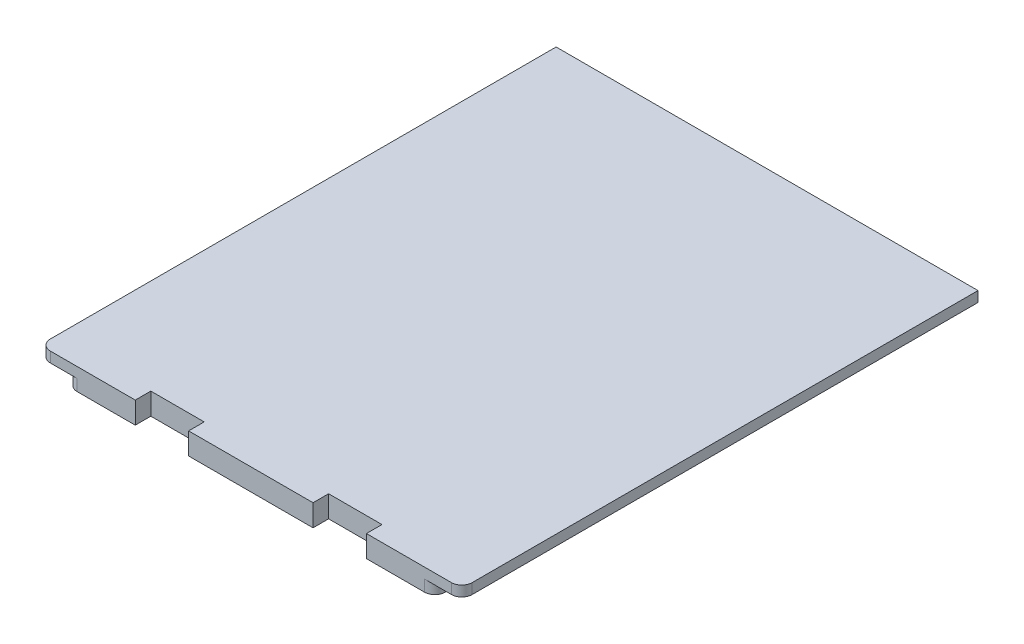
ISO-10303-21;
HEADER;
FILE_DESCRIPTION(('STEP AP214'),'2;1');
FILE_NAME('part.step','',(''),(''),'','','');
FILE_SCHEMA(('AUTOMOTIVE_DESIGN { 1 0 10303 214 1 1 1 1 }'));
ENDSEC;
DATA;
#1=APPLICATION_CONTEXT('core data for automotive mechanical design processes');
#2=APPLICATION_PROTOCOL_DEFINITION('international standard','automotive_design',2000,#1);
#3=PRODUCT_CONTEXT('',#1,'mechanical');
#4=PRODUCT('Part','Part','',(#3));
#5=PRODUCT_RELATED_PRODUCT_CATEGORY('part','',(#4));
#6=PRODUCT_DEFINITION_FORMATION('','',#4);
#7=PRODUCT_DEFINITION_CONTEXT('part definition',#1,'design');
#8=PRODUCT_DEFINITION('design','',#6,#7);
#9=PRODUCT_DEFINITION_SHAPE('','',#8);
#10=(LENGTH_UNIT() NAMED_UNIT(*) SI_UNIT(.MILLI.,.METRE.));
#11=(NAMED_UNIT(*) PLANE_ANGLE_UNIT() SI_UNIT($,.RADIAN.));
#12=(NAMED_UNIT(*) SI_UNIT($,.STERADIAN.) SOLID_ANGLE_UNIT());
#13=UNCERTAINTY_MEASURE_WITH_UNIT(LENGTH_MEASURE(1.E-05),#10,'distance_accuracy_value','');
#14=(GEOMETRIC_REPRESENTATION_CONTEXT(3) GLOBAL_UNCERTAINTY_ASSIGNED_CONTEXT((#13)) GLOBAL_UNIT_ASSIGNED_CONTEXT((#10,
#11,#12)) REPRESENTATION_CONTEXT('',''));
#15=CARTESIAN_POINT('',(0.,0.,0.));
#16=DIRECTION('',(0.,0.,1.));
#17=DIRECTION('',(1.,0.,0.));
#18=AXIS2_PLACEMENT_3D('',#15,#16,#17);
#19=CARTESIAN_POINT('',(35.5,0.,99.6));
#20=DIRECTION('',(0.,1.,0.));
#21=DIRECTION('',(0.,0.,1.));
#22=AXIS2_PLACEMENT_3D('',#19,#20,#21);
#23=PLANE('',#22);
#24=DIRECTION('',(0.,0.,-1.));
#25=VECTOR('',#24,1.);
#26=CARTESIAN_POINT('',(35.5,0.,99.6));
#27=LINE('',#26,#25);
#28=CARTESIAN_POINT('',(35.5,0.,97.6));
#29=VERTEX_POINT('',#28);
#30=CARTESIAN_POINT('',(35.5,0.,0.));
#31=VERTEX_POINT('',#30);
#32=EDGE_CURVE('E316',#29,#31,#27,.T.);
#33=ORIENTED_EDGE('',*,*,#32,.F.);
#34=CARTESIAN_POINT('',(33.5,0.,97.6));
#35=DIRECTION('',(0.,1.,0.));
#36=DIRECTION('',(0.,0.,1.));
#37=AXIS2_PLACEMENT_3D('',#34,#35,#36);
#38=CIRCLE('',#37,2.);
#39=CARTESIAN_POINT('',(33.5,0.,99.6));
#40=VERTEX_POINT('',#39);
#41=EDGE_CURVE('E366',#29,#40,#38,.F.);
#42=ORIENTED_EDGE('',*,*,#41,.T.);
#43=DIRECTION('',(1.,0.,0.));
#44=VECTOR('',#43,1.);
#45=CARTESIAN_POINT('',(35.5,0.,99.6));
#46=LINE('',#45,#44);
#47=CARTESIAN_POINT('',(22.3000000000007,0.,99.6000000000051));
#48=VERTEX_POINT('',#47);
#49=EDGE_CURVE('E245',#48,#40,#46,.T.);
#50=ORIENTED_EDGE('',*,*,#49,.F.);
#51=DIRECTION('',(0.,0.,1.00000000000004));
#52=VECTOR('',#51,1.);
#53=CARTESIAN_POINT('',(22.3000000000008,0.,0.));
#54=LINE('',#53,#52);
#55=CARTESIAN_POINT('',(22.3000000000007,0.,96.6000000000051));
#56=VERTEX_POINT('',#55);
#57=EDGE_CURVE('E399',#56,#48,#54,.T.);
#58=ORIENTED_EDGE('',*,*,#57,.F.);
#59=DIRECTION('',(-1.00000000000004,0.,0.));
#60=VECTOR('',#59,1.);
#61=CARTESIAN_POINT('',(0.,0.,96.6000000000051));
#62=LINE('',#61,#60);
#63=CARTESIAN_POINT('',(12.002190308565,0.,96.6000000000051));
#64=VERTEX_POINT('',#63);
#65=EDGE_CURVE('E419',#56,#64,#62,.T.);
#66=ORIENTED_EDGE('',*,*,#65,.T.);
#67=DIRECTION('',(0.,0.,-1.00000000000004));
#68=VECTOR('',#67,1.);
#69=CARTESIAN_POINT('',(12.002190308565,0.,0.));
#70=LINE('',#69,#68);
#71=CARTESIAN_POINT('',(12.002190308565,0.,99.6000000000051));
#72=VERTEX_POINT('',#71);
#73=EDGE_CURVE('E242',#72,#64,#70,.T.);
#74=ORIENTED_EDGE('',*,*,#73,.F.);
#75=CARTESIAN_POINT('',(-12.0021903085646,0.,99.6000000000022));
#76=VERTEX_POINT('',#75);
#77=EDGE_CURVE('E231',#76,#72,#46,.T.);
#78=ORIENTED_EDGE('',*,*,#77,.F.);
#79=DIRECTION('',(0.,0.,-1.00000000000002));
#80=VECTOR('',#79,1.);
#81=CARTESIAN_POINT('',(-12.0021903085645,0.,0.));
#82=LINE('',#81,#80);
#83=CARTESIAN_POINT('',(-12.0021903085646,0.,96.6000000000022));
#84=VERTEX_POINT('',#83);
#85=EDGE_CURVE('E211',#76,#84,#82,.T.);
#86=ORIENTED_EDGE('',*,*,#85,.T.);
#87=DIRECTION('',(-1.00000000000002,0.,0.));
#88=VECTOR('',#87,1.);
#89=CARTESIAN_POINT('',(0.,0.,96.6000000000022));
#90=LINE('',#89,#88);
#91=CARTESIAN_POINT('',(-22.3000000000002,0.,96.6000000000022));
#92=VERTEX_POINT('',#91);
#93=EDGE_CURVE('E427',#84,#92,#90,.T.);
#94=ORIENTED_EDGE('',*,*,#93,.T.);
#95=DIRECTION('',(0.,0.,1.00000000000002));
#96=VECTOR('',#95,1.);
#97=CARTESIAN_POINT('',(-22.3000000000001,0.,0.));
#98=LINE('',#97,#96);
#99=CARTESIAN_POINT('',(-22.3000000000002,0.,99.6000000000022));
#100=VERTEX_POINT('',#99);
#101=EDGE_CURVE('E223',#92,#100,#98,.T.);
#102=ORIENTED_EDGE('',*,*,#101,.T.);
#103=CARTESIAN_POINT('',(-33.5,0.,99.6));
#104=VERTEX_POINT('',#103);
#105=EDGE_CURVE('E244',#104,#100,#46,.T.);
#106=ORIENTED_EDGE('',*,*,#105,.F.);
#107=CARTESIAN_POINT('',(-33.5,0.,97.6));
#108=DIRECTION('',(0.,1.,0.));
#109=DIRECTION('',(0.,0.,1.));
#110=AXIS2_PLACEMENT_3D('',#107,#108,#109);
#111=CIRCLE('',#110,2.);
#112=CARTESIAN_POINT('',(-35.5,0.,97.6));
#113=VERTEX_POINT('',#112);
#114=EDGE_CURVE('E363',#104,#113,#111,.F.);
#115=ORIENTED_EDGE('',*,*,#114,.T.);
#116=DIRECTION('',(0.,0.,-1.));
#117=VECTOR('',#116,1.);
#118=CARTESIAN_POINT('',(-35.5,0.,99.6));
#119=LINE('',#118,#117);
#120=CARTESIAN_POINT('',(-35.5,0.,0.));
#121=VERTEX_POINT('',#120);
#122=EDGE_CURVE('E319',#113,#121,#119,.T.);
#123=ORIENTED_EDGE('',*,*,#122,.T.);
#124=DIRECTION('',(1.,0.,0.));
#125=VECTOR('',#124,1.);
#126=CARTESIAN_POINT('',(35.5,0.,0.));
#127=LINE('',#126,#125);
#128=EDGE_CURVE('E272',#121,#31,#127,.T.);
#129=ORIENTED_EDGE('',*,*,#128,.T.);
#130=EDGE_LOOP('',(#33,#42,#50,#58,#66,#74,#78,#86,#94,#102,#106,#115,#123,#129));
#131=FACE_BOUND('',#130,.T.);
#132=ADVANCED_FACE('F39',(#131),#23,.F.);
#133=CARTESIAN_POINT('',(-40.7,4.2,99.6));
#134=DIRECTION('',(0.,-1.,0.));
#135=DIRECTION('',(0.,0.,-1.));
#136=AXIS2_PLACEMENT_3D('',#133,#134,#135);
#137=PLANE('',#136);
#138=DIRECTION('',(0.,0.,-1.));
#139=VECTOR('',#138,1.);
#140=CARTESIAN_POINT('',(-12.0021903085646,4.2,99.6));
#141=LINE('',#140,#139);
#142=CARTESIAN_POINT('',(-12.0021903085646,4.2,99.6000000000022));
#143=VERTEX_POINT('',#142);
#144=CARTESIAN_POINT('',(-12.0021903085646,4.2,96.6000000000022));
#145=VERTEX_POINT('',#144);
#146=EDGE_CURVE('E255',#143,#145,#141,.T.);
#147=ORIENTED_EDGE('',*,*,#146,.F.);
#148=DIRECTION('',(-1.,0.,0.));
#149=VECTOR('',#148,1.);
#150=CARTESIAN_POINT('',(-40.7,4.2,99.6));
#151=LINE('',#150,#149);
#152=CARTESIAN_POINT('',(12.002190308565,4.2,99.6));
#153=VERTEX_POINT('',#152);
#154=EDGE_CURVE('E233',#153,#143,#151,.T.);
#155=ORIENTED_EDGE('',*,*,#154,.F.);
#156=DIRECTION('',(0.,0.,-1.));
#157=VECTOR('',#156,1.);
#158=CARTESIAN_POINT('',(12.002190308565,4.2,99.6));
#159=LINE('',#158,#157);
#160=CARTESIAN_POINT('',(12.002190308565,4.2,96.6000000000051));
#161=VERTEX_POINT('',#160);
#162=EDGE_CURVE('E406',#153,#161,#159,.T.);
#163=ORIENTED_EDGE('',*,*,#162,.T.);
#164=DIRECTION('',(-1.,0.,0.));
#165=VECTOR('',#164,1.);
#166=CARTESIAN_POINT('',(-40.7,4.2,96.6000000000051));
#167=LINE('',#166,#165);
#168=CARTESIAN_POINT('',(22.3000000000007,4.2,96.6000000000051));
#169=VERTEX_POINT('',#168);
#170=EDGE_CURVE('E235',#169,#161,#167,.T.);
#171=ORIENTED_EDGE('',*,*,#170,.F.);
#172=DIRECTION('',(0.,0.,1.));
#173=VECTOR('',#172,1.);
#174=CARTESIAN_POINT('',(22.3000000000007,4.2,99.6000000000001));
#175=LINE('',#174,#173);
#176=CARTESIAN_POINT('',(22.3000000000007,4.2,99.6000000000051));
#177=VERTEX_POINT('',#176);
#178=EDGE_CURVE('E397',#169,#177,#175,.T.);
#179=ORIENTED_EDGE('',*,*,#178,.T.);
#180=CARTESIAN_POINT('',(38.7,4.2,99.6));
#181=VERTEX_POINT('',#180);
#182=EDGE_CURVE('E261',#181,#177,#151,.T.);
#183=ORIENTED_EDGE('',*,*,#182,.F.);
#184=CARTESIAN_POINT('',(38.7,4.2,97.6));
#185=DIRECTION('',(0.,-1.,0.));
#186=DIRECTION('',(0.,0.,-1.));
#187=AXIS2_PLACEMENT_3D('',#184,#185,#186);
#188=CIRCLE('',#187,2.);
#189=CARTESIAN_POINT('',(40.7,4.2,97.6));
#190=VERTEX_POINT('',#189);
#191=EDGE_CURVE('E332',#181,#190,#188,.F.);
#192=ORIENTED_EDGE('',*,*,#191,.T.);
#193=DIRECTION('',(0.,0.,-1.));
#194=VECTOR('',#193,1.);
#195=CARTESIAN_POINT('',(40.7,4.2,99.6));
#196=LINE('',#195,#194);
#197=CARTESIAN_POINT('',(40.7,4.2,0.));
#198=VERTEX_POINT('',#197);
#199=EDGE_CURVE('E307',#190,#198,#196,.T.);
#200=ORIENTED_EDGE('',*,*,#199,.T.);
#201=DIRECTION('',(-1.,0.,0.));
#202=VECTOR('',#201,1.);
#203=CARTESIAN_POINT('',(-40.7,4.2,0.));
#204=LINE('',#203,#202);
#205=CARTESIAN_POINT('',(-40.7,4.2,0.));
#206=VERTEX_POINT('',#205);
#207=EDGE_CURVE('E288',#198,#206,#204,.T.);
#208=ORIENTED_EDGE('',*,*,#207,.T.);
#209=DIRECTION('',(0.,0.,-1.));
#210=VECTOR('',#209,1.);
#211=CARTESIAN_POINT('',(-40.7,4.2,99.6));
#212=LINE('',#211,#210);
#213=CARTESIAN_POINT('',(-40.7,4.2,97.6));
#214=VERTEX_POINT('',#213);
#215=EDGE_CURVE('E304',#214,#206,#212,.T.);
#216=ORIENTED_EDGE('',*,*,#215,.F.);
#217=CARTESIAN_POINT('',(-38.7,4.2,97.6));
#218=DIRECTION('',(0.,-1.,0.));
#219=DIRECTION('',(0.,0.,-1.));
#220=AXIS2_PLACEMENT_3D('',#217,#218,#219);
#221=CIRCLE('',#220,2.);
#222=CARTESIAN_POINT('',(-38.7,4.2,99.6));
#223=VERTEX_POINT('',#222);
#224=EDGE_CURVE('E334',#214,#223,#221,.F.);
#225=ORIENTED_EDGE('',*,*,#224,.T.);
#226=CARTESIAN_POINT('',(-22.3000000000003,4.2,99.6));
#227=VERTEX_POINT('',#226);
#228=EDGE_CURVE('E260',#227,#223,#151,.T.);
#229=ORIENTED_EDGE('',*,*,#228,.F.);
#230=DIRECTION('',(0.,0.,1.));
#231=VECTOR('',#230,1.);
#232=CARTESIAN_POINT('',(-22.3000000000003,4.2,99.6));
#233=LINE('',#232,#231);
#234=CARTESIAN_POINT('',(-22.3000000000002,4.2,96.6000000000022));
#235=VERTEX_POINT('',#234);
#236=EDGE_CURVE('E405',#235,#227,#233,.T.);
#237=ORIENTED_EDGE('',*,*,#236,.F.);
#238=DIRECTION('',(-1.,0.,0.));
#239=VECTOR('',#238,1.);
#240=CARTESIAN_POINT('',(-40.7,4.2,96.6000000000022));
#241=LINE('',#240,#239);
#242=EDGE_CURVE('E353',#145,#235,#241,.T.);
#243=ORIENTED_EDGE('',*,*,#242,.F.);
#244=EDGE_LOOP('',(#147,#155,#163,#171,#179,#183,#192,#200,#208,#216,#225,#229,#237,#243));
#245=FACE_BOUND('',#244,.T.);
#246=ADVANCED_FACE('F402',(#245),#137,.F.);
#247=CARTESIAN_POINT('',(0.,0.,99.6));
#248=DIRECTION('',(0.,0.,1.));
#249=DIRECTION('',(1.,0.,0.));
#250=AXIS2_PLACEMENT_3D('',#247,#248,#249);
#251=PLANE('',#250);
#252=ORIENTED_EDGE('',*,*,#154,.T.);
#253=DIRECTION('',(0.,-1.,0.));
#254=VECTOR('',#253,1.);
#255=CARTESIAN_POINT('',(-12.0021903085646,0.,99.6));
#256=LINE('',#255,#254);
#257=EDGE_CURVE('E214',#143,#76,#256,.T.);
#258=ORIENTED_EDGE('',*,*,#257,.T.);
#259=ORIENTED_EDGE('',*,*,#77,.T.);
#260=DIRECTION('',(0.,-1.,0.));
#261=VECTOR('',#260,1.);
#262=CARTESIAN_POINT('',(12.002190308565,0.,99.6));
#263=LINE('',#262,#261);
#264=EDGE_CURVE('E342',#153,#72,#263,.T.);
#265=ORIENTED_EDGE('',*,*,#264,.F.);
#266=EDGE_LOOP('',(#252,#258,#259,#265));
#267=FACE_BOUND('',#266,.T.);
#268=ADVANCED_FACE('F229',(#267),#251,.T.);
#269=DIRECTION('',(1.,0.,0.));
#270=VECTOR('',#269,1.);
#271=CARTESIAN_POINT('',(-35.5,2.20000000000001,99.6));
#272=LINE('',#271,#270);
#273=CARTESIAN_POINT('',(-38.7,2.2,99.6));
#274=VERTEX_POINT('',#273);
#275=CARTESIAN_POINT('',(-33.5,2.20000000000001,99.6));
#276=VERTEX_POINT('',#275);
#277=EDGE_CURVE('E69',#274,#276,#272,.T.);
#278=ORIENTED_EDGE('',*,*,#277,.T.);
#279=DIRECTION('',(0.,-1.,0.));
#280=VECTOR('',#279,1.);
#281=CARTESIAN_POINT('',(-33.5,0.,99.6));
#282=LINE('',#281,#280);
#283=EDGE_CURVE('E369',#276,#104,#282,.T.);
#284=ORIENTED_EDGE('',*,*,#283,.T.);
#285=ORIENTED_EDGE('',*,*,#105,.T.);
#286=DIRECTION('',(0.,1.,0.));
#287=VECTOR('',#286,1.);
#288=CARTESIAN_POINT('',(-22.3000000000003,0.,99.6));
#289=LINE('',#288,#287);
#290=EDGE_CURVE('E236',#100,#227,#289,.T.);
#291=ORIENTED_EDGE('',*,*,#290,.T.);
#292=ORIENTED_EDGE('',*,*,#228,.T.);
#293=DIRECTION('',(0.,-1.,0.));
#294=VECTOR('',#293,1.);
#295=CARTESIAN_POINT('',(-38.7,2.2,99.6));
#296=LINE('',#295,#294);
#297=EDGE_CURVE('E325',#223,#274,#296,.T.);
#298=ORIENTED_EDGE('',*,*,#297,.T.);
#299=EDGE_LOOP('',(#278,#284,#285,#291,#292,#298));
#300=FACE_BOUND('',#299,.T.);
#301=ADVANCED_FACE('F442',(#300),#251,.T.);
#302=ORIENTED_EDGE('',*,*,#49,.T.);
#303=DIRECTION('',(0.,1.,0.));
#304=VECTOR('',#303,1.);
#305=CARTESIAN_POINT('',(33.5,2.2,99.6));
#306=LINE('',#305,#304);
#307=CARTESIAN_POINT('',(33.5,2.20000000000001,99.6));
#308=VERTEX_POINT('',#307);
#309=EDGE_CURVE('E356',#40,#308,#306,.T.);
#310=ORIENTED_EDGE('',*,*,#309,.T.);
#311=DIRECTION('',(1.,0.,0.));
#312=VECTOR('',#311,1.);
#313=CARTESIAN_POINT('',(40.7,2.2,99.6));
#314=LINE('',#313,#312);
#315=CARTESIAN_POINT('',(38.7,2.2,99.6));
#316=VERTEX_POINT('',#315);
#317=EDGE_CURVE('E249',#308,#316,#314,.T.);
#318=ORIENTED_EDGE('',*,*,#317,.T.);
#319=DIRECTION('',(0.,1.,0.));
#320=VECTOR('',#319,1.);
#321=CARTESIAN_POINT('',(38.7,4.2,99.6));
#322=LINE('',#321,#320);
#323=EDGE_CURVE('E322',#316,#181,#322,.T.);
#324=ORIENTED_EDGE('',*,*,#323,.T.);
#325=ORIENTED_EDGE('',*,*,#182,.T.);
#326=DIRECTION('',(0.,1.,0.));
#327=VECTOR('',#326,1.);
#328=CARTESIAN_POINT('',(22.3000000000007,0.,99.6));
#329=LINE('',#328,#327);
#330=EDGE_CURVE('E345',#48,#177,#329,.T.);
#331=ORIENTED_EDGE('',*,*,#330,.F.);
#332=EDGE_LOOP('',(#302,#310,#318,#324,#325,#331));
#333=FACE_BOUND('',#332,.T.);
#334=ADVANCED_FACE('F392',(#333),#251,.T.);
#335=CARTESIAN_POINT('',(-35.5,0.,99.6));
#336=DIRECTION('',(1.,0.,0.));
#337=DIRECTION('',(0.,0.,-1.));
#338=AXIS2_PLACEMENT_3D('',#335,#336,#337);
#339=PLANE('',#338);
#340=ORIENTED_EDGE('',*,*,#122,.F.);
#341=DIRECTION('',(0.,-1.,0.));
#342=VECTOR('',#341,1.);
#343=CARTESIAN_POINT('',(-35.5,2.20000000000001,97.6));
#344=LINE('',#343,#342);
#345=CARTESIAN_POINT('',(-35.5,2.20000000000001,97.6));
#346=VERTEX_POINT('',#345);
#347=EDGE_CURVE('E58',#113,#346,#344,.F.);
#348=ORIENTED_EDGE('',*,*,#347,.T.);
#349=DIRECTION('',(0.,0.,-1.));
#350=VECTOR('',#349,1.);
#351=CARTESIAN_POINT('',(-35.5,2.20000000000001,99.6));
#352=LINE('',#351,#350);
#353=CARTESIAN_POINT('',(-35.5,2.20000000000001,0.));
#354=VERTEX_POINT('',#353);
#355=EDGE_CURVE('E267',#346,#354,#352,.T.);
#356=ORIENTED_EDGE('',*,*,#355,.T.);
#357=DIRECTION('',(0.,-1.,0.));
#358=VECTOR('',#357,1.);
#359=CARTESIAN_POINT('',(-35.5,0.,0.));
#360=LINE('',#359,#358);
#361=EDGE_CURVE('E268',#354,#121,#360,.T.);
#362=ORIENTED_EDGE('',*,*,#361,.T.);
#363=EDGE_LOOP('',(#340,#348,#356,#362));
#364=FACE_BOUND('',#363,.T.);
#365=ADVANCED_FACE('F471',(#364),#339,.F.);
#366=CARTESIAN_POINT('',(35.5,2.2,99.6));
#367=DIRECTION('',(-1.,0.,0.));
#368=DIRECTION('',(0.,0.,1.));
#369=AXIS2_PLACEMENT_3D('',#366,#367,#368);
#370=PLANE('',#369);
#371=DIRECTION('',(0.,0.,-1.));
#372=VECTOR('',#371,1.);
#373=CARTESIAN_POINT('',(35.5,2.2,99.6));
#374=LINE('',#373,#372);
#375=CARTESIAN_POINT('',(35.5,2.2,97.6));
#376=VERTEX_POINT('',#375);
#377=CARTESIAN_POINT('',(35.5,2.2,0.));
#378=VERTEX_POINT('',#377);
#379=EDGE_CURVE('E313',#376,#378,#374,.T.);
#380=ORIENTED_EDGE('',*,*,#379,.F.);
#381=DIRECTION('',(0.,1.,0.));
#382=VECTOR('',#381,1.);
#383=CARTESIAN_POINT('',(35.5,0.,97.6));
#384=LINE('',#383,#382);
#385=EDGE_CURVE('E360',#376,#29,#384,.F.);
#386=ORIENTED_EDGE('',*,*,#385,.T.);
#387=ORIENTED_EDGE('',*,*,#32,.T.);
#388=DIRECTION('',(0.,1.,0.));
#389=VECTOR('',#388,1.);
#390=CARTESIAN_POINT('',(35.5,2.2,0.));
#391=LINE('',#390,#389);
#392=EDGE_CURVE('E276',#31,#378,#391,.T.);
#393=ORIENTED_EDGE('',*,*,#392,.T.);
#394=EDGE_LOOP('',(#380,#386,#387,#393));
#395=FACE_BOUND('',#394,.T.);
#396=ADVANCED_FACE('F383',(#395),#370,.F.);
#397=CARTESIAN_POINT('',(40.7,2.2,99.6));
#398=DIRECTION('',(0.,1.,0.));
#399=DIRECTION('',(-1.,0.,0.));
#400=AXIS2_PLACEMENT_3D('',#397,#398,#399);
#401=PLANE('',#400);
#402=DIRECTION('',(0.,0.,-1.));
#403=VECTOR('',#402,1.);
#404=CARTESIAN_POINT('',(40.7,2.2,99.6));
#405=LINE('',#404,#403);
#406=CARTESIAN_POINT('',(40.7,2.2,97.6));
#407=VERTEX_POINT('',#406);
#408=CARTESIAN_POINT('',(40.7,2.2,0.));
#409=VERTEX_POINT('',#408);
#410=EDGE_CURVE('E310',#407,#409,#405,.T.);
#411=ORIENTED_EDGE('',*,*,#410,.F.);
#412=CARTESIAN_POINT('',(38.7,2.2,97.6));
#413=DIRECTION('',(0.,1.,0.));
#414=DIRECTION('',(-1.,0.,0.));
#415=AXIS2_PLACEMENT_3D('',#412,#413,#414);
#416=CIRCLE('',#415,2.);
#417=EDGE_CURVE('E340',#407,#316,#416,.F.);
#418=ORIENTED_EDGE('',*,*,#417,.T.);
#419=ORIENTED_EDGE('',*,*,#317,.F.);
#420=CARTESIAN_POINT('',(33.5,2.20000000000001,97.6));
#421=DIRECTION('',(0.,1.,0.));
#422=DIRECTION('',(-1.,0.,0.));
#423=AXIS2_PLACEMENT_3D('',#420,#421,#422);
#424=CIRCLE('',#423,2.);
#425=EDGE_CURVE('E48',#308,#376,#424,.T.);
#426=ORIENTED_EDGE('',*,*,#425,.T.);
#427=ORIENTED_EDGE('',*,*,#379,.T.);
#428=DIRECTION('',(1.,0.,0.));
#429=VECTOR('',#428,1.);
#430=CARTESIAN_POINT('',(40.7,2.2,0.));
#431=LINE('',#430,#429);
#432=EDGE_CURVE('E280',#378,#409,#431,.T.);
#433=ORIENTED_EDGE('',*,*,#432,.T.);
#434=EDGE_LOOP('',(#411,#418,#419,#426,#427,#433));
#435=FACE_BOUND('',#434,.T.);
#436=ADVANCED_FACE('F378',(#435),#401,.F.);
#437=CARTESIAN_POINT('',(40.7,4.2,99.6));
#438=DIRECTION('',(-1.,0.,0.));
#439=DIRECTION('',(0.,0.,1.));
#440=AXIS2_PLACEMENT_3D('',#437,#438,#439);
#441=PLANE('',#440);
#442=ORIENTED_EDGE('',*,*,#199,.F.);
#443=DIRECTION('',(0.,1.,0.));
#444=VECTOR('',#443,1.);
#445=CARTESIAN_POINT('',(40.7,2.2,97.6));
#446=LINE('',#445,#444);
#447=EDGE_CURVE('E338',#190,#407,#446,.F.);
#448=ORIENTED_EDGE('',*,*,#447,.T.);
#449=ORIENTED_EDGE('',*,*,#410,.T.);
#450=DIRECTION('',(0.,1.,0.));
#451=VECTOR('',#450,1.);
#452=CARTESIAN_POINT('',(40.7,4.2,0.));
#453=LINE('',#452,#451);
#454=EDGE_CURVE('E284',#409,#198,#453,.T.);
#455=ORIENTED_EDGE('',*,*,#454,.T.);
#456=EDGE_LOOP('',(#442,#448,#449,#455));
#457=FACE_BOUND('',#456,.T.);
#458=ADVANCED_FACE('F508',(#457),#441,.F.);
#459=CARTESIAN_POINT('',(-40.7,2.2,99.6));
#460=DIRECTION('',(1.,0.,0.));
#461=DIRECTION('',(0.,0.,-1.));
#462=AXIS2_PLACEMENT_3D('',#459,#460,#461);
#463=PLANE('',#462);
#464=DIRECTION('',(0.,0.,-1.));
#465=VECTOR('',#464,1.);
#466=CARTESIAN_POINT('',(-40.7,2.2,99.6));
#467=LINE('',#466,#465);
#468=CARTESIAN_POINT('',(-40.7,2.2,97.6));
#469=VERTEX_POINT('',#468);
#470=CARTESIAN_POINT('',(-40.7,2.2,0.));
#471=VERTEX_POINT('',#470);
#472=EDGE_CURVE('E301',#469,#471,#467,.T.);
#473=ORIENTED_EDGE('',*,*,#472,.F.);
#474=DIRECTION('',(0.,-1.,0.));
#475=VECTOR('',#474,1.);
#476=CARTESIAN_POINT('',(-40.7,4.2,97.6));
#477=LINE('',#476,#475);
#478=EDGE_CURVE('E329',#469,#214,#477,.F.);
#479=ORIENTED_EDGE('',*,*,#478,.T.);
#480=ORIENTED_EDGE('',*,*,#215,.T.);
#481=DIRECTION('',(0.,-1.,0.));
#482=VECTOR('',#481,1.);
#483=CARTESIAN_POINT('',(-40.7,2.2,0.));
#484=LINE('',#483,#482);
#485=EDGE_CURVE('E292',#206,#471,#484,.T.);
#486=ORIENTED_EDGE('',*,*,#485,.T.);
#487=EDGE_LOOP('',(#473,#479,#480,#486));
#488=FACE_BOUND('',#487,.T.);
#489=ADVANCED_FACE('F505',(#488),#463,.F.);
#490=CARTESIAN_POINT('',(-35.5,2.20000000000001,99.6));
#491=DIRECTION('',(0.,1.,0.));
#492=DIRECTION('',(-1.,0.,0.));
#493=AXIS2_PLACEMENT_3D('',#490,#491,#492);
#494=PLANE('',#493);
#495=ORIENTED_EDGE('',*,*,#277,.F.);
#496=CARTESIAN_POINT('',(-38.7,2.2,97.6));
#497=DIRECTION('',(0.,1.,0.));
#498=DIRECTION('',(-1.,0.,0.));
#499=AXIS2_PLACEMENT_3D('',#496,#497,#498);
#500=CIRCLE('',#499,2.);
#501=EDGE_CURVE('E327',#274,#469,#500,.F.);
#502=ORIENTED_EDGE('',*,*,#501,.T.);
#503=ORIENTED_EDGE('',*,*,#472,.T.);
#504=DIRECTION('',(1.,0.,0.));
#505=VECTOR('',#504,1.);
#506=CARTESIAN_POINT('',(-35.5,2.20000000000001,0.));
#507=LINE('',#506,#505);
#508=EDGE_CURVE('E252',#471,#354,#507,.T.);
#509=ORIENTED_EDGE('',*,*,#508,.T.);
#510=ORIENTED_EDGE('',*,*,#355,.F.);
#511=CARTESIAN_POINT('',(-33.5,2.20000000000001,97.6));
#512=DIRECTION('',(0.,1.,0.));
#513=DIRECTION('',(-1.,0.,0.));
#514=AXIS2_PLACEMENT_3D('',#511,#512,#513);
#515=CIRCLE('',#514,2.);
#516=EDGE_CURVE('E11',#346,#276,#515,.T.);
#517=ORIENTED_EDGE('',*,*,#516,.T.);
#518=EDGE_LOOP('',(#495,#502,#503,#509,#510,#517));
#519=FACE_BOUND('',#518,.T.);
#520=ADVANCED_FACE('F501',(#519),#494,.F.);
#521=CARTESIAN_POINT('',(0.,0.,0.));
#522=DIRECTION('',(0.,0.,1.));
#523=DIRECTION('',(1.,0.,0.));
#524=AXIS2_PLACEMENT_3D('',#521,#522,#523);
#525=PLANE('',#524);
#526=ORIENTED_EDGE('',*,*,#361,.F.);
#527=ORIENTED_EDGE('',*,*,#508,.F.);
#528=ORIENTED_EDGE('',*,*,#485,.F.);
#529=ORIENTED_EDGE('',*,*,#207,.F.);
#530=ORIENTED_EDGE('',*,*,#454,.F.);
#531=ORIENTED_EDGE('',*,*,#432,.F.);
#532=ORIENTED_EDGE('',*,*,#392,.F.);
#533=ORIENTED_EDGE('',*,*,#128,.F.);
#534=EDGE_LOOP('',(#526,#527,#528,#529,#530,#531,#532,#533));
#535=FACE_BOUND('',#534,.T.);
#536=ADVANCED_FACE('F478',(#535),#525,.F.);
#537=CARTESIAN_POINT('',(-38.7,0.,97.6));
#538=DIRECTION('',(0.,1.,0.));
#539=DIRECTION('',(0.,0.,1.));
#540=AXIS2_PLACEMENT_3D('',#537,#538,#539);
#541=CYLINDRICAL_SURFACE('',#540,2.);
#542=ORIENTED_EDGE('',*,*,#224,.F.);
#543=ORIENTED_EDGE('',*,*,#478,.F.);
#544=ORIENTED_EDGE('',*,*,#501,.F.);
#545=ORIENTED_EDGE('',*,*,#297,.F.);
#546=EDGE_LOOP('',(#542,#543,#544,#545));
#547=FACE_BOUND('',#546,.T.);
#548=ADVANCED_FACE('F474',(#547),#541,.T.);
#549=CARTESIAN_POINT('',(38.7,0.,97.6));
#550=DIRECTION('',(0.,-1.,0.));
#551=DIRECTION('',(0.,0.,-1.));
#552=AXIS2_PLACEMENT_3D('',#549,#550,#551);
#553=CYLINDRICAL_SURFACE('',#552,2.);
#554=ORIENTED_EDGE('',*,*,#417,.F.);
#555=ORIENTED_EDGE('',*,*,#447,.F.);
#556=ORIENTED_EDGE('',*,*,#191,.F.);
#557=ORIENTED_EDGE('',*,*,#323,.F.);
#558=EDGE_LOOP('',(#554,#555,#556,#557));
#559=FACE_BOUND('',#558,.T.);
#560=ADVANCED_FACE('F477',(#559),#553,.T.);
#561=CARTESIAN_POINT('',(0.,5.,96.6000000000051));
#562=DIRECTION('',(0.,0.,1.));
#563=DIRECTION('',(1.,0.,0.));
#564=AXIS2_PLACEMENT_3D('',#561,#562,#563);
#565=PLANE('',#564);
#566=ORIENTED_EDGE('',*,*,#170,.T.);
#567=DIRECTION('',(0.,-1.,0.));
#568=VECTOR('',#567,1.);
#569=CARTESIAN_POINT('',(12.002190308565,5.,96.6000000000051));
#570=LINE('',#569,#568);
#571=EDGE_CURVE('E413',#161,#64,#570,.T.);
#572=ORIENTED_EDGE('',*,*,#571,.T.);
#573=ORIENTED_EDGE('',*,*,#65,.F.);
#574=DIRECTION('',(0.,-1.,0.));
#575=VECTOR('',#574,1.);
#576=CARTESIAN_POINT('',(22.3000000000007,5.,96.6000000000051));
#577=LINE('',#576,#575);
#578=EDGE_CURVE('E224',#169,#56,#577,.T.);
#579=ORIENTED_EDGE('',*,*,#578,.F.);
#580=EDGE_LOOP('',(#566,#572,#573,#579));
#581=FACE_BOUND('',#580,.T.);
#582=ADVANCED_FACE('F481',(#581),#565,.T.);
#583=CARTESIAN_POINT('',(22.3000000000008,5.,0.));
#584=DIRECTION('',(1.,0.,0.));
#585=DIRECTION('',(0.,0.,-1.));
#586=AXIS2_PLACEMENT_3D('',#583,#584,#585);
#587=PLANE('',#586);
#588=ORIENTED_EDGE('',*,*,#578,.T.);
#589=ORIENTED_EDGE('',*,*,#57,.T.);
#590=ORIENTED_EDGE('',*,*,#330,.T.);
#591=ORIENTED_EDGE('',*,*,#178,.F.);
#592=EDGE_LOOP('',(#588,#589,#590,#591));
#593=FACE_BOUND('',#592,.T.);
#594=ADVANCED_FACE('F396',(#593),#587,.F.);
#595=CARTESIAN_POINT('',(12.002190308565,5.,0.));
#596=DIRECTION('',(-1.,0.,0.));
#597=DIRECTION('',(0.,0.,1.));
#598=AXIS2_PLACEMENT_3D('',#595,#596,#597);
#599=PLANE('',#598);
#600=ORIENTED_EDGE('',*,*,#264,.T.);
#601=ORIENTED_EDGE('',*,*,#73,.T.);
#602=ORIENTED_EDGE('',*,*,#571,.F.);
#603=ORIENTED_EDGE('',*,*,#162,.F.);
#604=EDGE_LOOP('',(#600,#601,#602,#603));
#605=FACE_BOUND('',#604,.T.);
#606=ADVANCED_FACE('F452',(#605),#599,.F.);
#607=CARTESIAN_POINT('',(0.,5.,96.6000000000022));
#608=DIRECTION('',(0.,0.,1.));
#609=DIRECTION('',(1.,0.,0.));
#610=AXIS2_PLACEMENT_3D('',#607,#608,#609);
#611=PLANE('',#610);
#612=ORIENTED_EDGE('',*,*,#242,.T.);
#613=DIRECTION('',(0.,-1.,0.));
#614=VECTOR('',#613,1.);
#615=CARTESIAN_POINT('',(-22.3000000000002,5.,96.6000000000022));
#616=LINE('',#615,#614);
#617=EDGE_CURVE('E424',#235,#92,#616,.T.);
#618=ORIENTED_EDGE('',*,*,#617,.T.);
#619=ORIENTED_EDGE('',*,*,#93,.F.);
#620=DIRECTION('',(0.,-1.,0.));
#621=VECTOR('',#620,1.);
#622=CARTESIAN_POINT('',(-12.0021903085646,5.,96.6000000000022));
#623=LINE('',#622,#621);
#624=EDGE_CURVE('E217',#145,#84,#623,.T.);
#625=ORIENTED_EDGE('',*,*,#624,.F.);
#626=EDGE_LOOP('',(#612,#618,#619,#625));
#627=FACE_BOUND('',#626,.T.);
#628=ADVANCED_FACE('F450',(#627),#611,.T.);
#629=CARTESIAN_POINT('',(-12.0021903085645,5.,0.));
#630=DIRECTION('',(-1.,0.,0.));
#631=DIRECTION('',(0.,0.,1.));
#632=AXIS2_PLACEMENT_3D('',#629,#630,#631);
#633=PLANE('',#632);
#634=ORIENTED_EDGE('',*,*,#146,.T.);
#635=ORIENTED_EDGE('',*,*,#624,.T.);
#636=ORIENTED_EDGE('',*,*,#85,.F.);
#637=ORIENTED_EDGE('',*,*,#257,.F.);
#638=EDGE_LOOP('',(#634,#635,#636,#637));
#639=FACE_BOUND('',#638,.T.);
#640=ADVANCED_FACE('F213',(#639),#633,.T.);
#641=CARTESIAN_POINT('',(-22.3000000000001,5.,0.));
#642=DIRECTION('',(1.,0.,0.));
#643=DIRECTION('',(0.,0.,-1.));
#644=AXIS2_PLACEMENT_3D('',#641,#642,#643);
#645=PLANE('',#644);
#646=ORIENTED_EDGE('',*,*,#236,.T.);
#647=ORIENTED_EDGE('',*,*,#290,.F.);
#648=ORIENTED_EDGE('',*,*,#101,.F.);
#649=ORIENTED_EDGE('',*,*,#617,.F.);
#650=EDGE_LOOP('',(#646,#647,#648,#649));
#651=FACE_BOUND('',#650,.T.);
#652=ADVANCED_FACE('F439',(#651),#645,.T.);
#653=CARTESIAN_POINT('',(33.5,0.,97.6));
#654=DIRECTION('',(0.,-1.,0.));
#655=DIRECTION('',(0.,0.,-1.));
#656=AXIS2_PLACEMENT_3D('',#653,#654,#655);
#657=CYLINDRICAL_SURFACE('',#656,2.);
#658=ORIENTED_EDGE('',*,*,#41,.F.);
#659=ORIENTED_EDGE('',*,*,#385,.F.);
#660=ORIENTED_EDGE('',*,*,#425,.F.);
#661=ORIENTED_EDGE('',*,*,#309,.F.);
#662=EDGE_LOOP('',(#658,#659,#660,#661));
#663=FACE_BOUND('',#662,.T.);
#664=ADVANCED_FACE('F387',(#663),#657,.T.);
#665=CARTESIAN_POINT('',(-33.5,0.,97.6));
#666=DIRECTION('',(0.,1.,0.));
#667=DIRECTION('',(0.,0.,1.));
#668=AXIS2_PLACEMENT_3D('',#665,#666,#667);
#669=CYLINDRICAL_SURFACE('',#668,2.);
#670=ORIENTED_EDGE('',*,*,#516,.F.);
#671=ORIENTED_EDGE('',*,*,#347,.F.);
#672=ORIENTED_EDGE('',*,*,#114,.F.);
#673=ORIENTED_EDGE('',*,*,#283,.F.);
#674=EDGE_LOOP('',(#670,#671,#672,#673));
#675=FACE_BOUND('',#674,.T.);
#676=ADVANCED_FACE('F41',(#675),#669,.T.);
#677=CLOSED_SHELL('',(#132,#246,#268,#301,#334,#365,#396,#436,#458,#489,#520,#536,#548,#560,
#582,#594,#606,#628,#640,#652,#664,#676));
#678=MANIFOLD_SOLID_BREP('B2',#677);
#679=ADVANCED_BREP_SHAPE_REPRESENTATION('',(#18,#678),#14);
#680=SHAPE_DEFINITION_REPRESENTATION(#9,#679);
ENDSEC;
END-ISO-10303-21;
